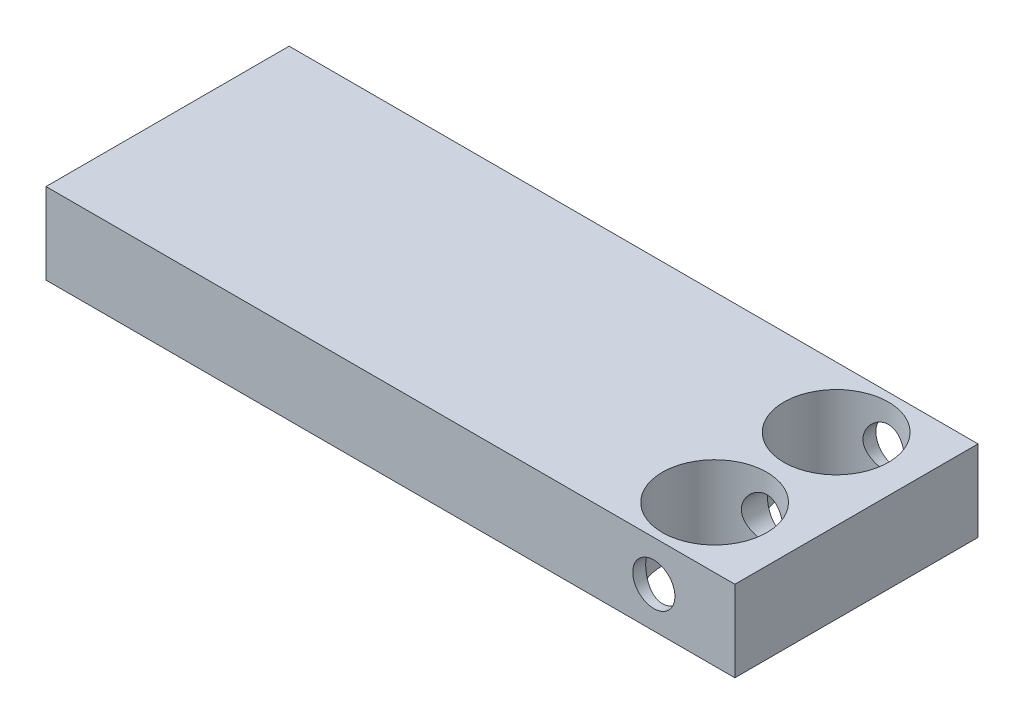
ISO-10303-21;
HEADER;
FILE_DESCRIPTION(('STEP AP214'),'2;1');
FILE_NAME('part.step','',(''),(''),'','','');
FILE_SCHEMA(('AUTOMOTIVE_DESIGN { 1 0 10303 214 1 1 1 1 }'));
ENDSEC;
DATA;
#1=APPLICATION_CONTEXT('core data for automotive mechanical design processes');
#2=APPLICATION_PROTOCOL_DEFINITION('international standard','automotive_design',2000,#1);
#3=PRODUCT_CONTEXT('',#1,'mechanical');
#4=PRODUCT('Part','Part','',(#3));
#5=PRODUCT_RELATED_PRODUCT_CATEGORY('part','',(#4));
#6=PRODUCT_DEFINITION_FORMATION('','',#4);
#7=PRODUCT_DEFINITION_CONTEXT('part definition',#1,'design');
#8=PRODUCT_DEFINITION('design','',#6,#7);
#9=PRODUCT_DEFINITION_SHAPE('','',#8);
#10=(LENGTH_UNIT() NAMED_UNIT(*) SI_UNIT(.MILLI.,.METRE.));
#11=(NAMED_UNIT(*) PLANE_ANGLE_UNIT() SI_UNIT($,.RADIAN.));
#12=(NAMED_UNIT(*) SI_UNIT($,.STERADIAN.) SOLID_ANGLE_UNIT());
#13=UNCERTAINTY_MEASURE_WITH_UNIT(LENGTH_MEASURE(1.E-05),#10,'distance_accuracy_value','');
#14=(GEOMETRIC_REPRESENTATION_CONTEXT(3) GLOBAL_UNCERTAINTY_ASSIGNED_CONTEXT((#13)) GLOBAL_UNIT_ASSIGNED_CONTEXT((#10,
#11,#12)) REPRESENTATION_CONTEXT('',''));
#15=CARTESIAN_POINT('',(0.,0.,0.));
#16=DIRECTION('',(0.,0.,1.));
#17=DIRECTION('',(1.,0.,0.));
#18=AXIS2_PLACEMENT_3D('',#15,#16,#17);
#19=CARTESIAN_POINT('',(0.,10.,0.));
#20=DIRECTION('',(0.,1.,0.));
#21=DIRECTION('',(0.,0.,1.));
#22=AXIS2_PLACEMENT_3D('',#19,#20,#21);
#23=PLANE('',#22);
#24=CARTESIAN_POINT('',(35.4054054054054,10.,-0.270270270270262));
#25=DIRECTION('',(0.,1.,0.));
#26=DIRECTION('',(0.,0.,1.));
#27=AXIS2_PLACEMENT_3D('',#24,#25,#26);
#28=CIRCLE('',#27,6.45);
#29=CARTESIAN_POINT('',(35.4054054054054,10.,6.17972972972973));
#30=VERTEX_POINT('',#29);
#31=EDGE_CURVE('E126',#30,#30,#28,.T.);
#32=ORIENTED_EDGE('',*,*,#31,.F.);
#33=EDGE_LOOP('',(#32));
#34=FACE_BOUND('',#33,.T.);
#35=DIRECTION('',(0.,0.,1.));
#36=VECTOR('',#35,1.);
#37=CARTESIAN_POINT('',(-39.5945945945946,10.,-7.77027027027026));
#38=LINE('',#37,#36);
#39=CARTESIAN_POINT('',(-39.5945945945946,10.,-7.77027027027026));
#40=VERTEX_POINT('',#39);
#41=CARTESIAN_POINT('',(-39.5945945945946,10.,22.2297297297297));
#42=VERTEX_POINT('',#41);
#43=EDGE_CURVE('E105',#40,#42,#38,.T.);
#44=ORIENTED_EDGE('',*,*,#43,.T.);
#45=DIRECTION('',(1.,0.,0.));
#46=VECTOR('',#45,1.);
#47=CARTESIAN_POINT('',(-39.5945945945946,10.,22.2297297297297));
#48=LINE('',#47,#46);
#49=CARTESIAN_POINT('',(45.4054054054054,10.,22.2297297297297));
#50=VERTEX_POINT('',#49);
#51=EDGE_CURVE('E100',#42,#50,#48,.T.);
#52=ORIENTED_EDGE('',*,*,#51,.T.);
#53=DIRECTION('',(0.,0.,-1.));
#54=VECTOR('',#53,1.);
#55=CARTESIAN_POINT('',(45.4054054054054,10.,-7.77027027027026));
#56=LINE('',#55,#54);
#57=CARTESIAN_POINT('',(45.4054054054054,10.,-7.77027027027026));
#58=VERTEX_POINT('',#57);
#59=EDGE_CURVE('E103',#50,#58,#56,.T.);
#60=ORIENTED_EDGE('',*,*,#59,.T.);
#61=DIRECTION('',(-1.,0.,0.));
#62=VECTOR('',#61,1.);
#63=CARTESIAN_POINT('',(-39.5945945945946,10.,-7.77027027027026));
#64=LINE('',#63,#62);
#65=EDGE_CURVE('E70',#58,#40,#64,.T.);
#66=ORIENTED_EDGE('',*,*,#65,.T.);
#67=EDGE_LOOP('',(#44,#52,#60,#66));
#68=FACE_BOUND('',#67,.T.);
#69=CARTESIAN_POINT('',(35.4054054054054,10.,14.7297297297297));
#70=DIRECTION('',(0.,1.,0.));
#71=DIRECTION('',(0.,0.,1.));
#72=AXIS2_PLACEMENT_3D('',#69,#70,#71);
#73=CIRCLE('',#72,6.45);
#74=CARTESIAN_POINT('',(35.4054054054054,10.,21.1797297297297));
#75=VERTEX_POINT('',#74);
#76=EDGE_CURVE('E215',#75,#75,#73,.T.);
#77=ORIENTED_EDGE('',*,*,#76,.F.);
#78=EDGE_LOOP('',(#77));
#79=FACE_BOUND('',#78,.T.);
#80=ADVANCED_FACE('F45',(#34,#68,#79),#23,.T.);
#81=CARTESIAN_POINT('',(0.,0.,0.));
#82=DIRECTION('',(0.,1.,0.));
#83=DIRECTION('',(0.,0.,1.));
#84=AXIS2_PLACEMENT_3D('',#81,#82,#83);
#85=PLANE('',#84);
#86=DIRECTION('',(0.,0.,1.));
#87=VECTOR('',#86,1.);
#88=CARTESIAN_POINT('',(-39.5945945945946,0.,-7.77027027027026));
#89=LINE('',#88,#87);
#90=CARTESIAN_POINT('',(-39.5945945945946,0.,-7.77027027027026));
#91=VERTEX_POINT('',#90);
#92=CARTESIAN_POINT('',(-39.5945945945946,0.,22.2297297297297));
#93=VERTEX_POINT('',#92);
#94=EDGE_CURVE('E122',#91,#93,#89,.T.);
#95=ORIENTED_EDGE('',*,*,#94,.F.);
#96=DIRECTION('',(-1.,0.,0.));
#97=VECTOR('',#96,1.);
#98=CARTESIAN_POINT('',(-39.5945945945946,0.,-7.77027027027026));
#99=LINE('',#98,#97);
#100=CARTESIAN_POINT('',(45.4054054054054,0.,-7.77027027027026));
#101=VERTEX_POINT('',#100);
#102=EDGE_CURVE('E93',#101,#91,#99,.T.);
#103=ORIENTED_EDGE('',*,*,#102,.F.);
#104=DIRECTION('',(0.,0.,-1.));
#105=VECTOR('',#104,1.);
#106=CARTESIAN_POINT('',(45.4054054054054,0.,-7.77027027027026));
#107=LINE('',#106,#105);
#108=CARTESIAN_POINT('',(45.4054054054054,0.,22.2297297297297));
#109=VERTEX_POINT('',#108);
#110=EDGE_CURVE('E87',#109,#101,#107,.T.);
#111=ORIENTED_EDGE('',*,*,#110,.F.);
#112=DIRECTION('',(1.,0.,0.));
#113=VECTOR('',#112,1.);
#114=CARTESIAN_POINT('',(-39.5945945945946,0.,22.2297297297297));
#115=LINE('',#114,#113);
#116=EDGE_CURVE('E110',#93,#109,#115,.T.);
#117=ORIENTED_EDGE('',*,*,#116,.F.);
#118=EDGE_LOOP('',(#95,#103,#111,#117));
#119=FACE_BOUND('',#118,.T.);
#120=CARTESIAN_POINT('',(35.4054054054054,0.,-0.270270270270262));
#121=DIRECTION('',(0.,1.,0.));
#122=DIRECTION('',(0.,0.,1.));
#123=AXIS2_PLACEMENT_3D('',#120,#121,#122);
#124=CIRCLE('',#123,6.45);
#125=CARTESIAN_POINT('',(35.4054054054054,0.,6.17972972972973));
#126=VERTEX_POINT('',#125);
#127=EDGE_CURVE('E221',#126,#126,#124,.T.);
#128=ORIENTED_EDGE('',*,*,#127,.T.);
#129=EDGE_LOOP('',(#128));
#130=FACE_BOUND('',#129,.T.);
#131=CARTESIAN_POINT('',(35.4054054054054,0.,14.7297297297297));
#132=DIRECTION('',(0.,1.,0.));
#133=DIRECTION('',(0.,0.,1.));
#134=AXIS2_PLACEMENT_3D('',#131,#132,#133);
#135=CIRCLE('',#134,6.45);
#136=CARTESIAN_POINT('',(35.4054054054054,0.,21.1797297297297));
#137=VERTEX_POINT('',#136);
#138=EDGE_CURVE('E212',#137,#137,#135,.T.);
#139=ORIENTED_EDGE('',*,*,#138,.T.);
#140=EDGE_LOOP('',(#139));
#141=FACE_BOUND('',#140,.T.);
#142=ADVANCED_FACE('F180',(#119,#130,#141),#85,.F.);
#143=CARTESIAN_POINT('',(-39.5945945945946,10.,-7.77027027027026));
#144=DIRECTION('',(1.,0.,0.));
#145=DIRECTION('',(0.,0.,-1.));
#146=AXIS2_PLACEMENT_3D('',#143,#144,#145);
#147=PLANE('',#146);
#148=ORIENTED_EDGE('',*,*,#94,.T.);
#149=DIRECTION('',(0.,-1.,0.));
#150=VECTOR('',#149,1.);
#151=CARTESIAN_POINT('',(-39.5945945945946,10.,22.2297297297297));
#152=LINE('',#151,#150);
#153=EDGE_CURVE('E11',#42,#93,#152,.T.);
#154=ORIENTED_EDGE('',*,*,#153,.F.);
#155=ORIENTED_EDGE('',*,*,#43,.F.);
#156=DIRECTION('',(0.,-1.,0.));
#157=VECTOR('',#156,1.);
#158=CARTESIAN_POINT('',(-39.5945945945946,10.,-7.77027027027026));
#159=LINE('',#158,#157);
#160=EDGE_CURVE('E118',#40,#91,#159,.T.);
#161=ORIENTED_EDGE('',*,*,#160,.T.);
#162=EDGE_LOOP('',(#148,#154,#155,#161));
#163=FACE_BOUND('',#162,.T.);
#164=ADVANCED_FACE('F47',(#163),#147,.F.);
#165=CARTESIAN_POINT('',(-39.5945945945946,10.,22.2297297297297));
#166=DIRECTION('',(0.,0.,-1.));
#167=DIRECTION('',(-1.,0.,0.));
#168=AXIS2_PLACEMENT_3D('',#165,#166,#167);
#169=PLANE('',#168);
#170=CARTESIAN_POINT('',(35.4054054054054,5.,22.2297297297297));
#171=DIRECTION('',(0.,0.,1.));
#172=DIRECTION('',(1.,0.,0.));
#173=AXIS2_PLACEMENT_3D('',#170,#171,#172);
#174=CIRCLE('',#173,2.6);
#175=CARTESIAN_POINT('',(38.0054054054054,5.,22.2297297297297));
#176=VERTEX_POINT('',#175);
#177=EDGE_CURVE('E165',#176,#176,#174,.T.);
#178=ORIENTED_EDGE('',*,*,#177,.F.);
#179=EDGE_LOOP('',(#178));
#180=FACE_BOUND('',#179,.T.);
#181=ORIENTED_EDGE('',*,*,#116,.T.);
#182=DIRECTION('',(0.,-1.,0.));
#183=VECTOR('',#182,1.);
#184=CARTESIAN_POINT('',(45.4054054054054,10.,22.2297297297297));
#185=LINE('',#184,#183);
#186=EDGE_CURVE('E61',#50,#109,#185,.T.);
#187=ORIENTED_EDGE('',*,*,#186,.F.);
#188=ORIENTED_EDGE('',*,*,#51,.F.);
#189=ORIENTED_EDGE('',*,*,#153,.T.);
#190=EDGE_LOOP('',(#181,#187,#188,#189));
#191=FACE_BOUND('',#190,.T.);
#192=ADVANCED_FACE('F109',(#180,#191),#169,.F.);
#193=CARTESIAN_POINT('',(45.4054054054054,10.,-7.77027027027026));
#194=DIRECTION('',(-1.,0.,0.));
#195=DIRECTION('',(0.,0.,1.));
#196=AXIS2_PLACEMENT_3D('',#193,#194,#195);
#197=PLANE('',#196);
#198=ORIENTED_EDGE('',*,*,#110,.T.);
#199=DIRECTION('',(0.,-1.,0.));
#200=VECTOR('',#199,1.);
#201=CARTESIAN_POINT('',(45.4054054054054,10.,-7.77027027027026));
#202=LINE('',#201,#200);
#203=EDGE_CURVE('E112',#58,#101,#202,.T.);
#204=ORIENTED_EDGE('',*,*,#203,.F.);
#205=ORIENTED_EDGE('',*,*,#59,.F.);
#206=ORIENTED_EDGE('',*,*,#186,.T.);
#207=EDGE_LOOP('',(#198,#204,#205,#206));
#208=FACE_BOUND('',#207,.T.);
#209=ADVANCED_FACE('F114',(#208),#197,.F.);
#210=CARTESIAN_POINT('',(-39.5945945945946,10.,-7.77027027027026));
#211=DIRECTION('',(0.,0.,1.));
#212=DIRECTION('',(1.,0.,0.));
#213=AXIS2_PLACEMENT_3D('',#210,#211,#212);
#214=PLANE('',#213);
#215=CARTESIAN_POINT('',(35.4054054054054,5.,-7.77027027027026));
#216=DIRECTION('',(0.,0.,1.));
#217=DIRECTION('',(1.,0.,0.));
#218=AXIS2_PLACEMENT_3D('',#215,#216,#217);
#219=CIRCLE('',#218,2.6);
#220=CARTESIAN_POINT('',(38.0054054054054,5.,-7.77027027027026));
#221=VERTEX_POINT('',#220);
#222=EDGE_CURVE('E142',#221,#221,#219,.T.);
#223=ORIENTED_EDGE('',*,*,#222,.T.);
#224=EDGE_LOOP('',(#223));
#225=FACE_BOUND('',#224,.T.);
#226=ORIENTED_EDGE('',*,*,#102,.T.);
#227=ORIENTED_EDGE('',*,*,#160,.F.);
#228=ORIENTED_EDGE('',*,*,#65,.F.);
#229=ORIENTED_EDGE('',*,*,#203,.T.);
#230=EDGE_LOOP('',(#226,#227,#228,#229));
#231=FACE_BOUND('',#230,.T.);
#232=ADVANCED_FACE('F175',(#225,#231),#214,.F.);
#233=CARTESIAN_POINT('',(35.4054054054054,10.,-0.270270270270262));
#234=DIRECTION('',(0.,-1.,0.));
#235=DIRECTION('',(0.,0.,-1.));
#236=AXIS2_PLACEMENT_3D('',#233,#234,#235);
#237=CYLINDRICAL_SURFACE('',#236,6.45);
#238=CARTESIAN_POINT('',(35.4054054054054,7.6,-6.72027027027026));
#239=CARTESIAN_POINT('',(35.2657419462468,7.59999038205517,-6.7202631002877));
#240=CARTESIAN_POINT('',(35.1258551095657,7.58868190361171,-6.71568222247505));
#241=CARTESIAN_POINT('',(34.8500206285896,7.54385000863757,-6.69780995819331));
#242=CARTESIAN_POINT('',(34.7140846528574,7.51026663301929,-6.68449506275354));
#243=CARTESIAN_POINT('',(34.4505978872858,7.42230490553845,-6.65058579473036));
#244=CARTESIAN_POINT('',(34.3230210723386,7.36799507805689,-6.63001542649913));
#245=CARTESIAN_POINT('',(34.0789059981247,7.24039717036632,-6.58361783485858));
#246=CARTESIAN_POINT('',(33.9623640154905,7.16711552300965,-6.55779239394219));
#247=CARTESIAN_POINT('',(33.7378993193193,6.999961359434,-6.50211390813422));
#248=CARTESIAN_POINT('',(33.6305717176527,6.90533207510746,-6.47213456417536));
#249=CARTESIAN_POINT('',(33.4328048571332,6.69976662799704,-6.41209815769984));
#250=CARTESIAN_POINT('',(33.3423739736275,6.58882242668423,-6.38204106408839));
#251=CARTESIAN_POINT('',(33.1769257558178,6.34766760376749,-6.32373474411173));
#252=CARTESIAN_POINT('',(33.1027935312608,6.21681137237152,-6.29562934425607));
#253=CARTESIAN_POINT('',(32.9778572845455,5.94318549034434,-6.2463938713192));
#254=CARTESIAN_POINT('',(32.9270420099822,5.80042162554914,-6.22526043506131));
#255=CARTESIAN_POINT('',(32.8525982860619,5.51387366656595,-6.19371961270866));
#256=CARTESIAN_POINT('',(32.8278293796454,5.3704369514393,-6.18286456552008));
#257=CARTESIAN_POINT('',(32.8026197743632,5.08106402109817,-6.1718138227281));
#258=CARTESIAN_POINT('',(32.8021668539287,4.93512909841648,-6.17161277227137));
#259=CARTESIAN_POINT('',(32.8247387741204,4.65593369999568,-6.18151140933674));
#260=CARTESIAN_POINT('',(32.8461019342147,4.52250798222447,-6.19088205542875));
#261=CARTESIAN_POINT('',(32.9089258884832,4.26132657685323,-6.21764308326412));
#262=CARTESIAN_POINT('',(32.9503902503682,4.13357190018719,-6.23503488863581));
#263=CARTESIAN_POINT('',(33.0530329075316,3.88424953516468,-6.27626270480321));
#264=CARTESIAN_POINT('',(33.1145993335968,3.76286327088356,-6.30022396482746));
#265=CARTESIAN_POINT('',(33.2554256456856,3.53169384308053,-6.35185740215699));
#266=CARTESIAN_POINT('',(33.3346922411655,3.42191510283981,-6.37953098506933));
#267=CARTESIAN_POINT('',(33.515991667815,3.20799491897171,-6.43812013183234));
#268=CARTESIAN_POINT('',(33.6193243662098,3.10497510205692,-6.46911953328473));
#269=CARTESIAN_POINT('',(33.8421256833445,2.91736446848621,-6.52902039425109));
#270=CARTESIAN_POINT('',(33.9615976078738,2.83277743670824,-6.55792142208671));
#271=CARTESIAN_POINT('',(34.2165089572047,2.68293035090453,-6.61111365258952));
#272=CARTESIAN_POINT('',(34.3522237999376,2.61809853864812,-6.6352991000307));
#273=CARTESIAN_POINT('',(34.6338559885896,2.5125733017806,-6.67553340079991));
#274=CARTESIAN_POINT('',(34.7797680246426,2.47186741751903,-6.69158645341751));
#275=CARTESIAN_POINT('',(35.0682562395174,2.41803242432591,-6.71297837073535));
#276=CARTESIAN_POINT('',(35.2105079855932,2.40339637007281,-6.71890186197903));
#277=CARTESIAN_POINT('',(35.4955449004454,2.39765895008398,-6.72121331446444));
#278=CARTESIAN_POINT('',(35.6383299183312,2.40655136631826,-6.71760379506062));
#279=CARTESIAN_POINT('',(35.9135083770391,2.4465156469635,-6.70163687708727));
#280=CARTESIAN_POINT('',(36.0460782871386,2.47655343873652,-6.68968754525255));
#281=CARTESIAN_POINT('',(36.3041700578754,2.5565428899223,-6.65866826891458));
#282=CARTESIAN_POINT('',(36.4296910131861,2.60649710064068,-6.63959741215941));
#283=CARTESIAN_POINT('',(36.674459605165,2.72653280691076,-6.59545404403335));
#284=CARTESIAN_POINT('',(36.793396395228,2.79718507198959,-6.57021527203339));
#285=CARTESIAN_POINT('',(37.0181455056816,2.95597928984146,-6.51646463258138));
#286=CARTESIAN_POINT('',(37.1239524935409,3.04412831120112,-6.48795144425287));
#287=CARTESIAN_POINT('',(37.3268813352617,3.24234015980941,-6.42838321968793));
#288=CARTESIAN_POINT('',(37.4229456525575,3.35347580481171,-6.39728591256287));
#289=CARTESIAN_POINT('',(37.595327292642,3.59083075699924,-6.33781334905604));
#290=CARTESIAN_POINT('',(37.6716411478385,3.7170527072108,-6.30943857121876));
#291=CARTESIAN_POINT('',(37.8028976567774,3.98302484065391,-6.25855565886851));
#292=CARTESIAN_POINT('',(37.8576079353415,4.12290294784876,-6.23611212977454));
#293=CARTESIAN_POINT('',(37.9422663420718,4.41106643119874,-6.20061459222546));
#294=CARTESIAN_POINT('',(37.9722331344662,4.55934538013497,-6.18755350747912));
#295=CARTESIAN_POINT('',(38.0047576703997,4.8484520388201,-6.17333334678912));
#296=CARTESIAN_POINT('',(38.0091544680152,4.98903481178426,-6.17137594381399));
#297=CARTESIAN_POINT('',(37.9952583274235,5.26883807785537,-6.1774878657262));
#298=CARTESIAN_POINT('',(37.9769683728479,5.40805874767155,-6.18555587212944));
#299=CARTESIAN_POINT('',(37.9197279065542,5.67536165887292,-6.21010057140454));
#300=CARTESIAN_POINT('',(37.8816504932208,5.80366659880845,-6.22622088173069));
#301=CARTESIAN_POINT('',(37.7867396699385,6.05211432633003,-6.26479759207405));
#302=CARTESIAN_POINT('',(37.7299010626496,6.1722548410235,-6.28725574758938));
#303=CARTESIAN_POINT('',(37.5952859224913,6.40853308097917,-6.33758957770906));
#304=CARTESIAN_POINT('',(37.5164888677089,6.52403782754705,-6.36570339479163));
#305=CARTESIAN_POINT('',(37.3416768638298,6.74076203686453,-6.42346638100369));
#306=CARTESIAN_POINT('',(37.2456565784516,6.84197705480249,-6.45311602394815));
#307=CARTESIAN_POINT('',(37.031539469372,7.03413649739572,-6.51297160415143));
#308=CARTESIAN_POINT('',(36.9124012479691,7.12395558230191,-6.54308416579553));
#309=CARTESIAN_POINT('',(36.6596452397415,7.28235552230899,-6.59847131585365));
#310=CARTESIAN_POINT('',(36.5260207900365,7.35092654803046,-6.62374366311981));
#311=CARTESIAN_POINT('',(36.2502892436918,7.46330470158072,-6.66618206030123));
#312=CARTESIAN_POINT('',(36.108381958242,7.50754176081678,-6.68348790029965));
#313=CARTESIAN_POINT('',(35.8912025004425,7.55529109649308,-6.70236355093613));
#314=CARTESIAN_POINT('',(35.8181568796531,7.56810332989692,-6.70747350155576));
#315=CARTESIAN_POINT('',(35.671120974962,7.58744537959769,-6.71521292036223));
#316=CARTESIAN_POINT('',(35.5971313909469,7.59397960424013,-6.71784412906777));
#317=CARTESIAN_POINT('',(35.4838388370266,7.59911413804369,-6.71991351947979));
#318=CARTESIAN_POINT('',(35.4446309313281,7.60000270127165,-6.72027228401343));
#319=CARTESIAN_POINT('',(35.4054054054054,7.6,-6.72027027027026));
#320=B_SPLINE_CURVE_WITH_KNOTS('',3,(#238,#239,#240,#241,#242,#243,#244,#245,#246,#247,#248,
#249,#250,#251,#252,#253,#254,#255,#256,#257,#258,#259,#260,#261,#262,#263,#264,#265,#266,#267,
#268,#269,#270,#271,#272,#273,#274,#275,#276,#277,#278,#279,#280,#281,#282,#283,#284,#285,#286,
#287,#288,#289,#290,#291,#292,#293,#294,#295,#296,#297,#298,#299,#300,#301,#302,#303,#304,#305,
#306,#307,#308,#309,#310,#311,#312,#313,#314,#315,#316,#317,#318,#319),.UNSPECIFIED.,.T.,.F.,(4,
2,2,2,2,2,2,2,2,2,2,2,2,2,2,2,2,2,2,2,2,2,2,2,2,2,2,2,2,2,2,2,2,2,2,2,2,2,2,2,4),(0.,
0.418858326151934,0.838848726759468,1.25746244707873,1.67593441181776,2.11260203339346,
2.54948553101386,3.0061839725446,3.46266178597055,3.89819456581584,4.33350843848995,
4.73797001017693,5.14250339500796,5.55536162095001,5.96837661210177,6.41386047177643,
6.85943571843231,7.31407662841734,7.76848253753769,8.19564651828701,8.62269762076299,
9.03019719641797,9.43774898980221,9.85781126699107,10.2780435935427,10.7264437075414,
11.1749224939022,11.6281017949148,12.0809389457232,12.5007605292067,12.9205269060163,
13.3231724715384,13.725929674131,14.1519718080367,14.5781461714997,15.0325667126685,
15.4871971566107,15.9335136685706,16.1562736266748,16.3788770507333,16.4965165409006),.UNSPECIFIED.);
#321=CARTESIAN_POINT('',(35.4054054054054,7.6,-6.72027027027026));
#322=VERTEX_POINT('',#321);
#323=EDGE_CURVE('E164',#322,#322,#320,.T.);
#324=ORIENTED_EDGE('',*,*,#323,.F.);
#325=EDGE_LOOP('',(#324));
#326=FACE_BOUND('',#325,.T.);
#327=CARTESIAN_POINT('',(38.0054054054054,5.,5.63248332445144));
#328=CARTESIAN_POINT('',(38.0054038183874,4.93039622589026,5.63248466666679));
#329=CARTESIAN_POINT('',(38.0026044301391,4.86076733361563,5.63372015345419));
#330=CARTESIAN_POINT('',(37.9914429455,4.72202920294244,5.63861612347938));
#331=CARTESIAN_POINT('',(37.9830772797036,4.6529203267836,5.64227816275088));
#332=CARTESIAN_POINT('',(37.9496883790676,4.44686300764134,5.65676649806262));
#333=CARTESIAN_POINT('',(37.9163735420933,4.31139821329843,5.6710944925393));
#334=CARTESIAN_POINT('',(37.829196441947,4.04904336574641,5.70718001967738));
#335=CARTESIAN_POINT('',(37.7754142918539,3.92212212255681,5.7289085507937));
#336=CARTESIAN_POINT('',(37.6490635439645,3.67911223953199,5.77729638654156));
#337=CARTESIAN_POINT('',(37.5765002308658,3.56302056492265,5.80395430352676));
#338=CARTESIAN_POINT('',(37.4101322127667,3.33817875053167,5.86093559608153));
#339=CARTESIAN_POINT('',(37.3154093663008,3.23013828926417,5.89137812024969));
#340=CARTESIAN_POINT('',(37.109341761922,3.03095339599392,5.95151524811804));
#341=CARTESIAN_POINT('',(36.9979908578179,2.93981523959622,5.98120957049873));
#342=CARTESIAN_POINT('',(36.7563363015533,2.77349095357243,6.03793672201518));
#343=CARTESIAN_POINT('',(36.6254513009537,2.69909197233703,6.06481487680812));
#344=CARTESIAN_POINT('',(36.351746087733,2.57367107400324,6.11143542126566));
#345=CARTESIAN_POINT('',(36.2089308817744,2.52263940821132,6.13118078595728));
#346=CARTESIAN_POINT('',(35.9228544958532,2.44793900000011,6.16046783378575));
#347=CARTESIAN_POINT('',(35.7799592317896,2.42305020100064,6.17046275440567));
#348=CARTESIAN_POINT('',(35.4916942587607,2.39741081965102,6.18076245094347));
#349=CARTESIAN_POINT('',(35.3463255068701,2.39665110430952,6.18107089324637));
#350=CARTESIAN_POINT('',(35.0660689231189,2.41862802901505,6.17223703593994));
#351=CARTESIAN_POINT('',(34.9310561578019,2.44002716951666,6.16363269822342));
#352=CARTESIAN_POINT('',(34.6667268921412,2.50343610538917,6.13866771074358));
#353=CARTESIAN_POINT('',(34.5374108107347,2.54544741384201,6.12230649157211));
#354=CARTESIAN_POINT('',(34.2858063014517,2.64940163141033,6.08311214765929));
#355=CARTESIAN_POINT('',(34.1636536531848,2.71163623022827,6.06018493108449));
#356=CARTESIAN_POINT('',(33.9312092819071,2.85399491426008,6.01012807410721));
#357=CARTESIAN_POINT('',(33.8209216694708,2.93412516993975,5.98299698518979));
#358=CARTESIAN_POINT('',(33.6075444975967,3.11621333012426,5.92514899205904));
#359=CARTESIAN_POINT('',(33.505422438673,3.21926898424483,5.89431361280501));
#360=CARTESIAN_POINT('',(33.3195097294696,3.44115447804795,5.83391805358998));
#361=CARTESIAN_POINT('',(33.2357252703282,3.55998962351099,5.80435830700379));
#362=CARTESIAN_POINT('',(33.0866042914782,3.81445269128155,5.74904767245005));
#363=CARTESIAN_POINT('',(33.0218748470604,3.95046835212671,5.72343248562795));
#364=CARTESIAN_POINT('',(32.9166261934004,4.23277697379599,5.68050676360105));
#365=CARTESIAN_POINT('',(32.8760909690322,4.37906306436607,5.66319073634828));
#366=CARTESIAN_POINT('',(32.822754544611,4.66809990366188,5.64016222638382));
#367=CARTESIAN_POINT('',(32.8083939801241,4.81051029687909,5.63379868894681));
#368=CARTESIAN_POINT('',(32.8032606039087,5.09581719468189,5.63153958252019));
#369=CARTESIAN_POINT('',(32.8124804628772,5.23871353443705,5.63564076087084));
#370=CARTESIAN_POINT('',(32.8528257877748,5.5121851947789,5.65317997627253));
#371=CARTESIAN_POINT('',(32.8826445662014,5.64299347094675,5.66606048101078));
#372=CARTESIAN_POINT('',(32.9616394829102,5.89765961446308,5.69901160191172));
#373=CARTESIAN_POINT('',(33.0108199560952,6.02151591822957,5.71908382814323));
#374=CARTESIAN_POINT('',(33.1293856558832,6.26441427744971,5.76516054255573));
#375=CARTESIAN_POINT('',(33.1995150635284,6.38305217168714,5.79137410343673));
#376=CARTESIAN_POINT('',(33.3572309356406,6.60742146812071,5.84646507465129));
#377=CARTESIAN_POINT('',(33.4448245928562,6.71314752347715,5.87534357991595));
#378=CARTESIAN_POINT('',(33.6427603210991,6.91696180428627,5.93513374079457));
#379=CARTESIAN_POINT('',(33.7543180536067,7.0138769770192,5.96603490139834));
#380=CARTESIAN_POINT('',(33.9928475542748,7.18779864948334,6.02434942691997));
#381=CARTESIAN_POINT('',(34.1198200405775,7.26480422114295,6.05176262921896));
#382=CARTESIAN_POINT('',(34.3861002927607,7.39647027001732,6.10011503469354));
#383=CARTESIAN_POINT('',(34.5254110076491,7.45112538753348,6.1210526847214));
#384=CARTESIAN_POINT('',(34.812302864501,7.53585620873891,6.15402168266951));
#385=CARTESIAN_POINT('',(34.9598793861058,7.56594550038311,6.16605795381116));
#386=CARTESIAN_POINT('',(35.2485904442283,7.59906007277214,6.17933493225414));
#387=CARTESIAN_POINT('',(35.3895058741674,7.60374304603838,6.18123672816584));
#388=CARTESIAN_POINT('',(35.670049195685,7.59030415205941,6.17582430279032));
#389=CARTESIAN_POINT('',(35.8096772848586,7.57218584534272,6.16851152040317));
#390=CARTESIAN_POINT('',(36.0791582529252,7.51484484827698,6.14582560176382));
#391=CARTESIAN_POINT('',(36.2091805768885,7.4763065763059,6.13071425570649));
#392=CARTESIAN_POINT('',(36.4608869374456,7.37994347024276,6.09405618773982));
#393=CARTESIAN_POINT('',(36.5825693350117,7.32211485808884,6.07250820528547));
#394=CARTESIAN_POINT('',(36.8200853539594,7.18592029624102,6.02389605319785));
#395=CARTESIAN_POINT('',(36.9354188009715,7.10675592688042,5.99662931202871));
#396=CARTESIAN_POINT('',(37.1516430387492,6.93133510811346,5.9398562038017));
#397=CARTESIAN_POINT('',(37.2525288958846,6.83507284505899,5.91034907692496));
#398=CARTESIAN_POINT('',(37.4435764531786,6.62101759950106,5.85010728436316));
#399=CARTESIAN_POINT('',(37.5326646819353,6.50225127781417,5.81941212502575));
#400=CARTESIAN_POINT('',(37.6897680696528,6.25049133148065,5.76224152212826));
#401=CARTESIAN_POINT('',(37.7577718160718,6.11749005399,5.735768367593));
#402=CARTESIAN_POINT('',(37.8698243571796,5.84173981796869,5.69066974721471));
#403=CARTESIAN_POINT('',(37.9140801273518,5.69908770321673,5.67197680534514));
#404=CARTESIAN_POINT('',(37.9616714259737,5.48069816294379,5.65157684016016));
#405=CARTESIAN_POINT('',(37.974399888433,5.40723929233943,5.64605174972594));
#406=CARTESIAN_POINT('',(37.9935069238418,5.25936468014916,5.63771998662662));
#407=CARTESIAN_POINT('',(37.9998902131653,5.18494969098617,5.63491129490144));
#408=CARTESIAN_POINT('',(38.0046243184031,5.07362560028069,5.63282719221343));
#409=CARTESIAN_POINT('',(38.0054062448448,5.0368163139072,5.63248261449825));
#410=CARTESIAN_POINT('',(38.0054054054054,5.,5.63248332445144));
#411=B_SPLINE_CURVE_WITH_KNOTS('',3,(#327,#328,#329,#330,#331,#332,#333,#334,#335,#336,#337,
#338,#339,#340,#341,#342,#343,#344,#345,#346,#347,#348,#349,#350,#351,#352,#353,#354,#355,#356,
#357,#358,#359,#360,#361,#362,#363,#364,#365,#366,#367,#368,#369,#370,#371,#372,#373,#374,#375,
#376,#377,#378,#379,#380,#381,#382,#383,#384,#385,#386,#387,#388,#389,#390,#391,#392,#393,#394,
#395,#396,#397,#398,#399,#400,#401,#402,#403,#404,#405,#406,#407,#408,#409,#410),.UNSPECIFIED.,
.T.,.F.,(4,2,2,2,2,2,2,2,2,2,2,2,2,2,2,2,2,2,2,2,2,2,2,2,2,2,2,2,2,2,2,2,2,2,2,2,2,2,2,2,2,4),
(0.,0.20878025038681,0.417694511436458,0.83615739796894,1.25299891058497,1.66972325841475,
2.10841662826191,2.54727255455877,3.00374397766061,3.46002478992617,3.89391110017773,
4.32763318010816,4.7366205842868,5.14563801558645,5.5608382187257,5.97618180553605,
6.41916683088421,6.86230118686252,7.31831727587141,7.77403117378063,8.20157763136725,
8.62899121446678,9.03151907271618,9.43413710449762,9.85322411010324,10.2724840769079,
10.7232866906059,11.1741103143531,11.6250419835029,12.0757240620905,12.4966116075007,
12.9174334374696,13.3249681233629,13.7325826728628,14.1583102072339,14.584182776121,
15.0368386574869,15.4897391249748,15.9386254434699,16.1626374861385,16.3864828956206,
16.4969154021072),.UNSPECIFIED.);
#412=CARTESIAN_POINT('',(38.0054054054054,5.,5.63248332445144));
#413=VERTEX_POINT('',#412);
#414=EDGE_CURVE('E157',#413,#413,#411,.T.);
#415=ORIENTED_EDGE('',*,*,#414,.F.);
#416=EDGE_LOOP('',(#415));
#417=FACE_BOUND('',#416,.T.);
#418=ORIENTED_EDGE('',*,*,#31,.T.);
#419=EDGE_LOOP('',(#418));
#420=FACE_BOUND('',#419,.T.);
#421=ORIENTED_EDGE('',*,*,#127,.F.);
#422=EDGE_LOOP('',(#421));
#423=FACE_BOUND('',#422,.T.);
#424=ADVANCED_FACE('F171',(#326,#417,#420,#423),#237,.F.);
#425=CARTESIAN_POINT('',(35.4054054054054,10.,14.7297297297297));
#426=DIRECTION('',(0.,-1.,0.));
#427=DIRECTION('',(0.,0.,-1.));
#428=AXIS2_PLACEMENT_3D('',#425,#426,#427);
#429=CYLINDRICAL_SURFACE('',#428,6.45);
#430=CARTESIAN_POINT('',(35.4054054054054,7.6,8.27972972972974));
#431=CARTESIAN_POINT('',(35.2657419462468,7.59999038205517,8.27973689971231));
#432=CARTESIAN_POINT('',(35.1258551095657,7.58868190361171,8.28431777752495));
#433=CARTESIAN_POINT('',(34.8500206285896,7.54385000863757,8.30219004180669));
#434=CARTESIAN_POINT('',(34.7140846528574,7.51026663301929,8.31550493724646));
#435=CARTESIAN_POINT('',(34.4505978872858,7.42230490553845,8.34941420526964));
#436=CARTESIAN_POINT('',(34.3230210723386,7.36799507805689,8.36998457350087));
#437=CARTESIAN_POINT('',(34.0789059981247,7.24039717036632,8.41638216514142));
#438=CARTESIAN_POINT('',(33.9623640154905,7.16711552300965,8.44220760605781));
#439=CARTESIAN_POINT('',(33.7378993193193,6.999961359434,8.49788609186578));
#440=CARTESIAN_POINT('',(33.6305717176527,6.90533207510746,8.52786543582464));
#441=CARTESIAN_POINT('',(33.4328048571332,6.69976662799704,8.58790184230016));
#442=CARTESIAN_POINT('',(33.3423739736275,6.58882242668423,8.61795893591161));
#443=CARTESIAN_POINT('',(33.1769257558178,6.34766760376749,8.67626525588827));
#444=CARTESIAN_POINT('',(33.1027935312608,6.21681137237152,8.70437065574392));
#445=CARTESIAN_POINT('',(32.9778572845455,5.94318549034434,8.7536061286808));
#446=CARTESIAN_POINT('',(32.9270420099822,5.80042162554914,8.77473956493869));
#447=CARTESIAN_POINT('',(32.8525982860619,5.51387366656595,8.80628038729134));
#448=CARTESIAN_POINT('',(32.8278293796454,5.3704369514393,8.81713543447992));
#449=CARTESIAN_POINT('',(32.8026197743632,5.08106402109817,8.8281861772719));
#450=CARTESIAN_POINT('',(32.8021668539287,4.93512909841648,8.82838722772863));
#451=CARTESIAN_POINT('',(32.8247387741204,4.65593369999568,8.81848859066326));
#452=CARTESIAN_POINT('',(32.8461019342147,4.52250798222448,8.80911794457125));
#453=CARTESIAN_POINT('',(32.9089258884832,4.26132657685324,8.78235691673588));
#454=CARTESIAN_POINT('',(32.9503902503682,4.13357190018719,8.76496511136419));
#455=CARTESIAN_POINT('',(33.0530329075316,3.88424953516468,8.72373729519679));
#456=CARTESIAN_POINT('',(33.1145993335968,3.76286327088356,8.69977603517254));
#457=CARTESIAN_POINT('',(33.2554256456856,3.53169384308053,8.64814259784301));
#458=CARTESIAN_POINT('',(33.3346922411655,3.42191510283981,8.62046901493067));
#459=CARTESIAN_POINT('',(33.515991667815,3.20799491897171,8.56187986816766));
#460=CARTESIAN_POINT('',(33.6193243662098,3.10497510205692,8.53088046671527));
#461=CARTESIAN_POINT('',(33.8421256833445,2.91736446848621,8.47097960574891));
#462=CARTESIAN_POINT('',(33.9615976078738,2.83277743670824,8.44207857791329));
#463=CARTESIAN_POINT('',(34.2165089572047,2.68293035090453,8.38888634741048));
#464=CARTESIAN_POINT('',(34.3522237999376,2.61809853864812,8.36470089996929));
#465=CARTESIAN_POINT('',(34.6338559885896,2.5125733017806,8.32446659920009));
#466=CARTESIAN_POINT('',(34.7797680246426,2.47186741751903,8.30841354658249));
#467=CARTESIAN_POINT('',(35.0682562395174,2.41803242432591,8.28702162926465));
#468=CARTESIAN_POINT('',(35.2105079855932,2.40339637007281,8.28109813802097));
#469=CARTESIAN_POINT('',(35.4955449004453,2.39765895008398,8.27878668553555));
#470=CARTESIAN_POINT('',(35.6383299183312,2.40655136631826,8.28239620493938));
#471=CARTESIAN_POINT('',(35.9135083770391,2.44651564696349,8.29836312291273));
#472=CARTESIAN_POINT('',(36.0460782871386,2.47655343873652,8.31031245474745));
#473=CARTESIAN_POINT('',(36.3041700578754,2.5565428899223,8.34133173108542));
#474=CARTESIAN_POINT('',(36.4296910131861,2.60649710064067,8.36040258784058));
#475=CARTESIAN_POINT('',(36.6744596051649,2.72653280691076,8.40454595596664));
#476=CARTESIAN_POINT('',(36.793396395228,2.79718507198959,8.4297847279666));
#477=CARTESIAN_POINT('',(37.0181455056816,2.95597928984146,8.48353536741861));
#478=CARTESIAN_POINT('',(37.1239524935409,3.04412831120112,8.51204855574713));
#479=CARTESIAN_POINT('',(37.3268813352617,3.24234015980941,8.57161678031207));
#480=CARTESIAN_POINT('',(37.4229456525575,3.35347580481171,8.60271408743713));
#481=CARTESIAN_POINT('',(37.595327292642,3.59083075699924,8.66218665094396));
#482=CARTESIAN_POINT('',(37.6716411478385,3.7170527072108,8.69056142878124));
#483=CARTESIAN_POINT('',(37.8028976567774,3.98302484065391,8.74144434113149));
#484=CARTESIAN_POINT('',(37.8576079353415,4.12290294784876,8.76388787022546));
#485=CARTESIAN_POINT('',(37.9422663420718,4.41106643119874,8.79938540777454));
#486=CARTESIAN_POINT('',(37.9722331344662,4.55934538013497,8.81244649252088));
#487=CARTESIAN_POINT('',(38.0047576703997,4.8484520388201,8.82666665321089));
#488=CARTESIAN_POINT('',(38.0091544680152,4.98903481178426,8.82862405618601));
#489=CARTESIAN_POINT('',(37.9952583274235,5.26883807785536,8.8225121342738));
#490=CARTESIAN_POINT('',(37.9769683728479,5.40805874767154,8.81444412787056));
#491=CARTESIAN_POINT('',(37.9197279065542,5.67536165887292,8.78989942859546));
#492=CARTESIAN_POINT('',(37.8816504932208,5.80366659880845,8.77377911826931));
#493=CARTESIAN_POINT('',(37.7867396699385,6.05211432633003,8.73520240792595));
#494=CARTESIAN_POINT('',(37.7299010626496,6.1722548410235,8.71274425241062));
#495=CARTESIAN_POINT('',(37.5952859224913,6.40853308097917,8.66241042229094));
#496=CARTESIAN_POINT('',(37.5164888677089,6.52403782754705,8.63429660520837));
#497=CARTESIAN_POINT('',(37.3416768638298,6.74076203686453,8.57653361899631));
#498=CARTESIAN_POINT('',(37.2456565784516,6.84197705480249,8.54688397605185));
#499=CARTESIAN_POINT('',(37.031539469372,7.03413649739571,8.48702839584857));
#500=CARTESIAN_POINT('',(36.9124012479691,7.12395558230191,8.45691583420447));
#501=CARTESIAN_POINT('',(36.6596452397415,7.28235552230899,8.40152868414635));
#502=CARTESIAN_POINT('',(36.5260207900365,7.35092654803046,8.37625633688019));
#503=CARTESIAN_POINT('',(36.2502892436918,7.46330470158072,8.33381793969877));
#504=CARTESIAN_POINT('',(36.108381958242,7.50754176081678,8.31651209970034));
#505=CARTESIAN_POINT('',(35.8912025004425,7.55529109649309,8.29763644906387));
#506=CARTESIAN_POINT('',(35.8181568796531,7.56810332989692,8.29252649844424));
#507=CARTESIAN_POINT('',(35.671120974962,7.58744537959769,8.28478707963777));
#508=CARTESIAN_POINT('',(35.5971313909469,7.59397960424013,8.28215587093223));
#509=CARTESIAN_POINT('',(35.4838388370266,7.59911413804369,8.28008648052021));
#510=CARTESIAN_POINT('',(35.4446309313281,7.60000270127165,8.27972771598657));
#511=CARTESIAN_POINT('',(35.4054054054054,7.6,8.27972972972974));
#512=B_SPLINE_CURVE_WITH_KNOTS('',3,(#430,#431,#432,#433,#434,#435,#436,#437,#438,#439,#440,
#441,#442,#443,#444,#445,#446,#447,#448,#449,#450,#451,#452,#453,#454,#455,#456,#457,#458,#459,
#460,#461,#462,#463,#464,#465,#466,#467,#468,#469,#470,#471,#472,#473,#474,#475,#476,#477,#478,
#479,#480,#481,#482,#483,#484,#485,#486,#487,#488,#489,#490,#491,#492,#493,#494,#495,#496,#497,
#498,#499,#500,#501,#502,#503,#504,#505,#506,#507,#508,#509,#510,#511),.UNSPECIFIED.,.T.,.F.,(4,
2,2,2,2,2,2,2,2,2,2,2,2,2,2,2,2,2,2,2,2,2,2,2,2,2,2,2,2,2,2,2,2,2,2,2,2,2,2,2,4),(0.,
0.418858326151934,0.838848726759468,1.25746244707873,1.67593441181776,2.11260203339346,
2.54948553101386,3.0061839725446,3.46266178597055,3.89819456581584,4.33350843848995,
4.73797001017693,5.14250339500796,5.55536162095001,5.96837661210177,6.41386047177643,
6.85943571843231,7.31407662841734,7.76848253753769,8.19564651828701,8.62269762076298,
9.03019719641797,9.4377489898022,9.85781126699106,10.2780435935427,10.7264437075414,
11.1749224939022,11.6281017949148,12.0809389457232,12.5007605292067,12.9205269060163,
13.3231724715384,13.725929674131,14.1519718080367,14.5781461714997,15.0325667126685,
15.4871971566107,15.9335136685706,16.1562736266748,16.3788770507333,16.4965165409006),.UNSPECIFIED.);
#513=CARTESIAN_POINT('',(35.4054054054054,7.6,8.27972972972974));
#514=VERTEX_POINT('',#513);
#515=EDGE_CURVE('E49',#514,#514,#512,.T.);
#516=ORIENTED_EDGE('',*,*,#515,.F.);
#517=EDGE_LOOP('',(#516));
#518=FACE_BOUND('',#517,.T.);
#519=CARTESIAN_POINT('',(38.0054054054054,5.,20.6324833244514));
#520=CARTESIAN_POINT('',(38.0054038183874,4.93039622589026,20.6324846666668));
#521=CARTESIAN_POINT('',(38.0026044301391,4.86076733361563,20.6337201534542));
#522=CARTESIAN_POINT('',(37.9914429455,4.72202920294244,20.6386161234794));
#523=CARTESIAN_POINT('',(37.9830772797036,4.6529203267836,20.6422781627509));
#524=CARTESIAN_POINT('',(37.9496883790676,4.44686300764134,20.6567664980626));
#525=CARTESIAN_POINT('',(37.9163735420933,4.31139821329843,20.6710944925393));
#526=CARTESIAN_POINT('',(37.829196441947,4.04904336574641,20.7071800196774));
#527=CARTESIAN_POINT('',(37.7754142918539,3.92212212255681,20.7289085507937));
#528=CARTESIAN_POINT('',(37.6490635439645,3.67911223953199,20.7772963865416));
#529=CARTESIAN_POINT('',(37.5765002308658,3.56302056492265,20.8039543035268));
#530=CARTESIAN_POINT('',(37.4101322127667,3.33817875053167,20.8609355960815));
#531=CARTESIAN_POINT('',(37.3154093663008,3.23013828926417,20.8913781202497));
#532=CARTESIAN_POINT('',(37.109341761922,3.03095339599392,20.951515248118));
#533=CARTESIAN_POINT('',(36.9979908578179,2.93981523959622,20.9812095704987));
#534=CARTESIAN_POINT('',(36.7563363015533,2.77349095357243,21.0379367220152));
#535=CARTESIAN_POINT('',(36.6254513009537,2.69909197233703,21.0648148768081));
#536=CARTESIAN_POINT('',(36.351746087733,2.57367107400324,21.1114354212657));
#537=CARTESIAN_POINT('',(36.2089308817744,2.52263940821132,21.1311807859573));
#538=CARTESIAN_POINT('',(35.9228544958532,2.44793900000011,21.1604678337858));
#539=CARTESIAN_POINT('',(35.7799592317896,2.42305020100064,21.1704627544057));
#540=CARTESIAN_POINT('',(35.4916942587607,2.39741081965102,21.1807624509435));
#541=CARTESIAN_POINT('',(35.3463255068701,2.39665110430952,21.1810708932464));
#542=CARTESIAN_POINT('',(35.0660689231189,2.41862802901505,21.1722370359399));
#543=CARTESIAN_POINT('',(34.9310561578019,2.44002716951666,21.1636326982234));
#544=CARTESIAN_POINT('',(34.6667268921412,2.50343610538917,21.1386677107436));
#545=CARTESIAN_POINT('',(34.5374108107347,2.54544741384201,21.1223064915721));
#546=CARTESIAN_POINT('',(34.2858063014517,2.64940163141033,21.0831121476593));
#547=CARTESIAN_POINT('',(34.1636536531848,2.71163623022827,21.0601849310845));
#548=CARTESIAN_POINT('',(33.9312092819071,2.85399491426008,21.0101280741072));
#549=CARTESIAN_POINT('',(33.8209216694708,2.93412516993975,20.9829969851898));
#550=CARTESIAN_POINT('',(33.6075444975967,3.11621333012426,20.925148992059));
#551=CARTESIAN_POINT('',(33.505422438673,3.21926898424483,20.894313612805));
#552=CARTESIAN_POINT('',(33.3195097294696,3.44115447804795,20.83391805359));
#553=CARTESIAN_POINT('',(33.2357252703282,3.55998962351099,20.8043583070038));
#554=CARTESIAN_POINT('',(33.0866042914782,3.81445269128155,20.74904767245));
#555=CARTESIAN_POINT('',(33.0218748470604,3.9504683521267,20.7234324856279));
#556=CARTESIAN_POINT('',(32.9166261934004,4.23277697379599,20.680506763601));
#557=CARTESIAN_POINT('',(32.8760909690322,4.37906306436606,20.6631907363483));
#558=CARTESIAN_POINT('',(32.822754544611,4.66809990366188,20.6401622263838));
#559=CARTESIAN_POINT('',(32.8083939801241,4.81051029687909,20.6337986889468));
#560=CARTESIAN_POINT('',(32.8032606039087,5.0958171946819,20.6315395825202));
#561=CARTESIAN_POINT('',(32.8124804628772,5.23871353443706,20.6356407608708));
#562=CARTESIAN_POINT('',(32.8528257877748,5.5121851947789,20.6531799762725));
#563=CARTESIAN_POINT('',(32.8826445662014,5.64299347094675,20.6660604810108));
#564=CARTESIAN_POINT('',(32.9616394829102,5.89765961446308,20.6990116019117));
#565=CARTESIAN_POINT('',(33.0108199560952,6.02151591822957,20.7190838281432));
#566=CARTESIAN_POINT('',(33.1293856558832,6.26441427744971,20.7651605425557));
#567=CARTESIAN_POINT('',(33.1995150635284,6.38305217168714,20.7913741034367));
#568=CARTESIAN_POINT('',(33.3572309356406,6.60742146812071,20.8464650746513));
#569=CARTESIAN_POINT('',(33.4448245928562,6.71314752347715,20.8753435799159));
#570=CARTESIAN_POINT('',(33.6427603210991,6.91696180428627,20.9351337407946));
#571=CARTESIAN_POINT('',(33.7543180536067,7.0138769770192,20.9660349013983));
#572=CARTESIAN_POINT('',(33.9928475542748,7.18779864948333,21.02434942692));
#573=CARTESIAN_POINT('',(34.1198200405775,7.26480422114295,21.051762629219));
#574=CARTESIAN_POINT('',(34.3861002927607,7.39647027001732,21.1001150346935));
#575=CARTESIAN_POINT('',(34.5254110076491,7.45112538753348,21.1210526847214));
#576=CARTESIAN_POINT('',(34.812302864501,7.53585620873891,21.1540216826695));
#577=CARTESIAN_POINT('',(34.9598793861058,7.56594550038311,21.1660579538112));
#578=CARTESIAN_POINT('',(35.2485904442283,7.59906007277214,21.1793349322541));
#579=CARTESIAN_POINT('',(35.3895058741674,7.60374304603838,21.1812367281658));
#580=CARTESIAN_POINT('',(35.670049195685,7.59030415205941,21.1758243027903));
#581=CARTESIAN_POINT('',(35.8096772848586,7.57218584534272,21.1685115204032));
#582=CARTESIAN_POINT('',(36.0791582529252,7.51484484827698,21.1458256017638));
#583=CARTESIAN_POINT('',(36.2091805768885,7.4763065763059,21.1307142557065));
#584=CARTESIAN_POINT('',(36.4608869374456,7.37994347024276,21.0940561877398));
#585=CARTESIAN_POINT('',(36.5825693350117,7.32211485808884,21.0725082052855));
#586=CARTESIAN_POINT('',(36.8200853539594,7.18592029624102,21.0238960531979));
#587=CARTESIAN_POINT('',(36.9354188009715,7.10675592688042,20.9966293120287));
#588=CARTESIAN_POINT('',(37.1516430387492,6.93133510811346,20.9398562038017));
#589=CARTESIAN_POINT('',(37.2525288958846,6.83507284505899,20.910349076925));
#590=CARTESIAN_POINT('',(37.4435764531786,6.62101759950106,20.8501072843632));
#591=CARTESIAN_POINT('',(37.5326646819353,6.50225127781417,20.8194121250257));
#592=CARTESIAN_POINT('',(37.6897680696528,6.25049133148065,20.7622415221283));
#593=CARTESIAN_POINT('',(37.7577718160718,6.11749005399,20.735768367593));
#594=CARTESIAN_POINT('',(37.8698243571796,5.8417398179687,20.6906697472147));
#595=CARTESIAN_POINT('',(37.9140801273518,5.69908770321673,20.6719768053451));
#596=CARTESIAN_POINT('',(37.9616714259737,5.48069816294379,20.6515768401602));
#597=CARTESIAN_POINT('',(37.974399888433,5.40723929233943,20.6460517497259));
#598=CARTESIAN_POINT('',(37.9935069238418,5.25936468014916,20.6377199866266));
#599=CARTESIAN_POINT('',(37.9998902131653,5.18494969098617,20.6349112949014));
#600=CARTESIAN_POINT('',(38.0046243184031,5.07362560028069,20.6328271922134));
#601=CARTESIAN_POINT('',(38.0054062448448,5.0368163139072,20.6324826144982));
#602=CARTESIAN_POINT('',(38.0054054054054,5.,20.6324833244514));
#603=B_SPLINE_CURVE_WITH_KNOTS('',3,(#519,#520,#521,#522,#523,#524,#525,#526,#527,#528,#529,
#530,#531,#532,#533,#534,#535,#536,#537,#538,#539,#540,#541,#542,#543,#544,#545,#546,#547,#548,
#549,#550,#551,#552,#553,#554,#555,#556,#557,#558,#559,#560,#561,#562,#563,#564,#565,#566,#567,
#568,#569,#570,#571,#572,#573,#574,#575,#576,#577,#578,#579,#580,#581,#582,#583,#584,#585,#586,
#587,#588,#589,#590,#591,#592,#593,#594,#595,#596,#597,#598,#599,#600,#601,#602),.UNSPECIFIED.,
.T.,.F.,(4,2,2,2,2,2,2,2,2,2,2,2,2,2,2,2,2,2,2,2,2,2,2,2,2,2,2,2,2,2,2,2,2,2,2,2,2,2,2,2,2,4),
(0.,0.20878025038681,0.417694511436458,0.83615739796894,1.25299891058497,1.66972325841475,
2.10841662826191,2.54727255455877,3.00374397766061,3.46002478992617,3.89391110017773,
4.32763318010816,4.7366205842868,5.14563801558645,5.56083821872569,5.97618180553605,
6.41916683088421,6.86230118686252,7.3183172758714,7.77403117378063,8.20157763136725,
8.62899121446678,9.03151907271618,9.43413710449762,9.85322411010323,10.2724840769079,
10.7232866906059,11.174110314353,11.6250419835029,12.0757240620905,12.4966116075007,
12.9174334374696,13.3249681233629,13.7325826728628,14.1583102072339,14.584182776121,
15.0368386574869,15.4897391249748,15.9386254434699,16.1626374861385,16.3864828956206,
16.4969154021072),.UNSPECIFIED.);
#604=CARTESIAN_POINT('',(38.0054054054054,5.,20.6324833244514));
#605=VERTEX_POINT('',#604);
#606=EDGE_CURVE('E136',#605,#605,#603,.T.);
#607=ORIENTED_EDGE('',*,*,#606,.F.);
#608=EDGE_LOOP('',(#607));
#609=FACE_BOUND('',#608,.T.);
#610=ORIENTED_EDGE('',*,*,#76,.T.);
#611=EDGE_LOOP('',(#610));
#612=FACE_BOUND('',#611,.T.);
#613=ORIENTED_EDGE('',*,*,#138,.F.);
#614=EDGE_LOOP('',(#613));
#615=FACE_BOUND('',#614,.T.);
#616=ADVANCED_FACE('F143',(#518,#609,#612,#615),#429,.F.);
#617=CARTESIAN_POINT('',(35.4054054054054,5.,-7.77027027027026));
#618=DIRECTION('',(0.,0.,1.));
#619=DIRECTION('',(1.,0.,0.));
#620=AXIS2_PLACEMENT_3D('',#617,#618,#619);
#621=CYLINDRICAL_SURFACE('',#620,2.6);
#622=ORIENTED_EDGE('',*,*,#606,.T.);
#623=EDGE_LOOP('',(#622));
#624=FACE_BOUND('',#623,.T.);
#625=ORIENTED_EDGE('',*,*,#177,.T.);
#626=EDGE_LOOP('',(#625));
#627=FACE_BOUND('',#626,.T.);
#628=ADVANCED_FACE('F146',(#624,#627),#621,.F.);
#629=ORIENTED_EDGE('',*,*,#414,.T.);
#630=EDGE_LOOP('',(#629));
#631=FACE_BOUND('',#630,.T.);
#632=ORIENTED_EDGE('',*,*,#515,.T.);
#633=EDGE_LOOP('',(#632));
#634=FACE_BOUND('',#633,.T.);
#635=ADVANCED_FACE('F149',(#631,#634),#621,.F.);
#636=ORIENTED_EDGE('',*,*,#323,.T.);
#637=EDGE_LOOP('',(#636));
#638=FACE_BOUND('',#637,.T.);
#639=ORIENTED_EDGE('',*,*,#222,.F.);
#640=EDGE_LOOP('',(#639));
#641=FACE_BOUND('',#640,.T.);
#642=ADVANCED_FACE('F151',(#638,#641),#621,.F.);
#643=CLOSED_SHELL('',(#80,#142,#164,#192,#209,#232,#424,#616,#628,#635,#642));
#644=MANIFOLD_SOLID_BREP('B2',#643);
#645=ADVANCED_BREP_SHAPE_REPRESENTATION('',(#18,#644),#14);
#646=SHAPE_DEFINITION_REPRESENTATION(#9,#645);
ENDSEC;
END-ISO-10303-21;
